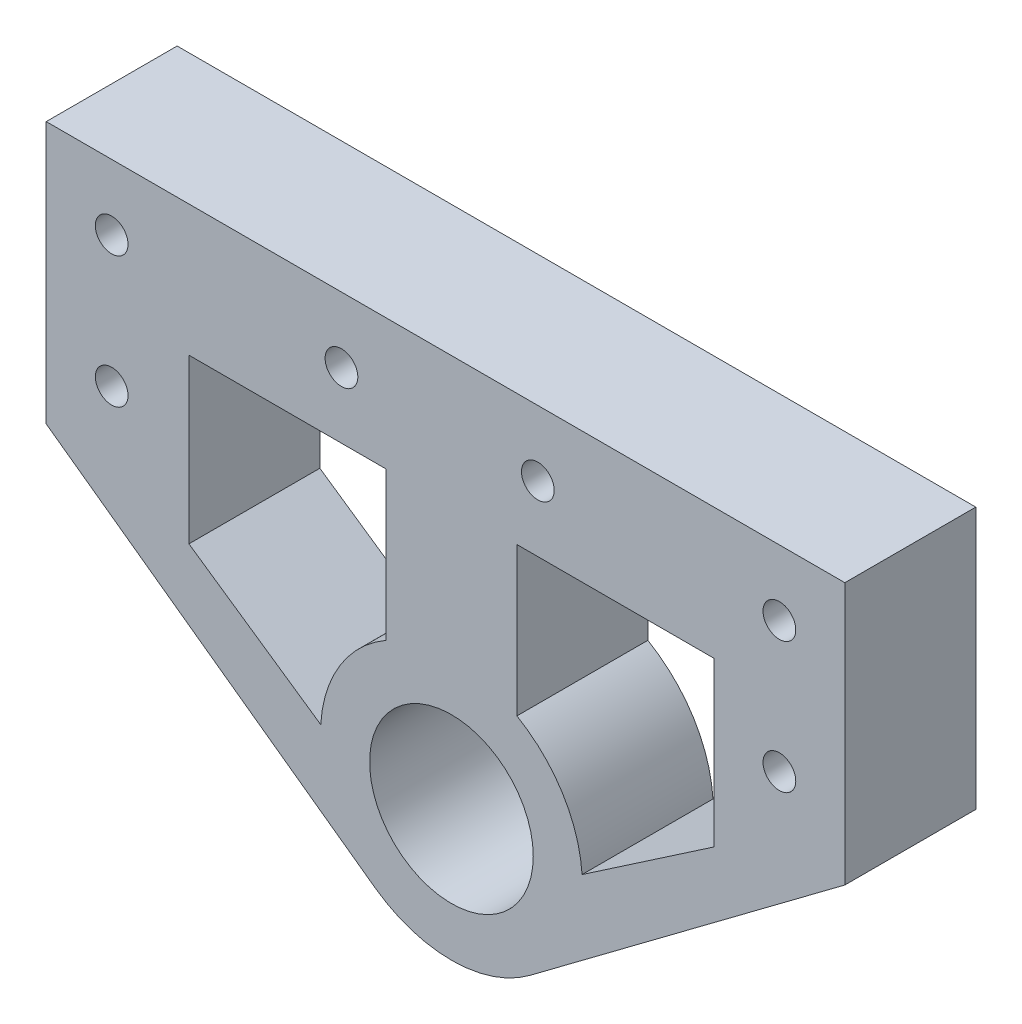
ISO-10303-21;
HEADER;
FILE_DESCRIPTION(('STEP AP214'),'2;1');
FILE_NAME('part.step','',(''),(''),'','','');
FILE_SCHEMA(('AUTOMOTIVE_DESIGN { 1 0 10303 214 1 1 1 1 }'));
ENDSEC;
DATA;
#1=APPLICATION_CONTEXT('core data for automotive mechanical design processes');
#2=APPLICATION_PROTOCOL_DEFINITION('international standard','automotive_design',2000,#1);
#3=PRODUCT_CONTEXT('',#1,'mechanical');
#4=PRODUCT('Part','Part','',(#3));
#5=PRODUCT_RELATED_PRODUCT_CATEGORY('part','',(#4));
#6=PRODUCT_DEFINITION_FORMATION('','',#4);
#7=PRODUCT_DEFINITION_CONTEXT('part definition',#1,'design');
#8=PRODUCT_DEFINITION('design','',#6,#7);
#9=PRODUCT_DEFINITION_SHAPE('','',#8);
#10=(LENGTH_UNIT() NAMED_UNIT(*) SI_UNIT(.MILLI.,.METRE.));
#11=(NAMED_UNIT(*) PLANE_ANGLE_UNIT() SI_UNIT($,.RADIAN.));
#12=(NAMED_UNIT(*) SI_UNIT($,.STERADIAN.) SOLID_ANGLE_UNIT());
#13=UNCERTAINTY_MEASURE_WITH_UNIT(LENGTH_MEASURE(1.E-05),#10,'distance_accuracy_value','');
#14=(GEOMETRIC_REPRESENTATION_CONTEXT(3) GLOBAL_UNCERTAINTY_ASSIGNED_CONTEXT((#13)) GLOBAL_UNIT_ASSIGNED_CONTEXT((#10,
#11,#12)) REPRESENTATION_CONTEXT('',''));
#15=CARTESIAN_POINT('',(0.,0.,0.));
#16=DIRECTION('',(0.,0.,1.));
#17=DIRECTION('',(1.,0.,0.));
#18=AXIS2_PLACEMENT_3D('',#15,#16,#17);
#19=CARTESIAN_POINT('',(0.,0.,12.7));
#20=DIRECTION('',(0.,0.,-1.));
#21=DIRECTION('',(-1.,0.,0.));
#22=AXIS2_PLACEMENT_3D('',#19,#20,#21);
#23=PLANE('',#22);
#24=DIRECTION('',(0.823987913618756,-0.566607375711091,0.));
#25=VECTOR('',#24,1.);
#26=CARTESIAN_POINT('',(-22.3811581632653,16.1254515802812,12.7));
#27=LINE('',#26,#25);
#28=CARTESIAN_POINT('',(-22.3811581632653,16.1254515802812,12.7));
#29=VERTEX_POINT('',#28);
#30=CARTESIAN_POINT('',(-9.59510921226123,7.33324780871722,12.7));
#31=VERTEX_POINT('',#30);
#32=EDGE_CURVE('E170',#29,#31,#27,.T.);
#33=ORIENTED_EDGE('',*,*,#32,.F.);
#34=DIRECTION('',(0.,-1.,0.));
#35=VECTOR('',#34,1.);
#36=CARTESIAN_POINT('',(-22.3811581632653,31.9767857142857,12.7));
#37=LINE('',#36,#35);
#38=CARTESIAN_POINT('',(-22.3811581632653,31.9767857142857,12.7));
#39=VERTEX_POINT('',#38);
#40=EDGE_CURVE('E176',#39,#29,#37,.T.);
#41=ORIENTED_EDGE('',*,*,#40,.F.);
#42=DIRECTION('',(-1.,0.,0.));
#43=VECTOR('',#42,1.);
#44=CARTESIAN_POINT('',(-22.3811581632653,31.9767857142857,12.7));
#45=LINE('',#44,#43);
#46=CARTESIAN_POINT('',(-3.26765816326529,31.9767857142857,12.7));
#47=VERTEX_POINT('',#46);
#48=EDGE_CURVE('E185',#47,#39,#45,.T.);
#49=ORIENTED_EDGE('',*,*,#48,.F.);
#50=DIRECTION('',(0.,1.,0.));
#51=VECTOR('',#50,1.);
#52=CARTESIAN_POINT('',(-3.26765816326529,31.9767857142857,12.7));
#53=LINE('',#52,#51);
#54=CARTESIAN_POINT('',(-3.26765816326529,17.5753083423481,12.7));
#55=VERTEX_POINT('',#54);
#56=EDGE_CURVE('E181',#55,#47,#53,.T.);
#57=ORIENTED_EDGE('',*,*,#56,.F.);
#58=CARTESIAN_POINT('',(3.08234183673471,6.5767857142857,12.7));
#59=DIRECTION('',(0.,0.,-1.));
#60=DIRECTION('',(-1.,0.,0.));
#61=AXIS2_PLACEMENT_3D('',#58,#59,#60);
#62=CIRCLE('',#61,12.7);
#63=EDGE_CURVE('E158',#31,#55,#62,.T.);
#64=ORIENTED_EDGE('',*,*,#63,.F.);
#65=EDGE_LOOP('',(#33,#41,#49,#57,#64));
#66=FACE_BOUND('',#65,.T.);
#67=DIRECTION('',(0.826436407611551,0.563030073951751,0.));
#68=VECTOR('',#67,1.);
#69=CARTESIAN_POINT('',(28.5458418367347,16.1254515802812,12.7));
#70=LINE('',#69,#68);
#71=CARTESIAN_POINT('',(15.7548939946992,7.41130461980597,12.7));
#72=VERTEX_POINT('',#71);
#73=CARTESIAN_POINT('',(28.5458418367347,16.1254515802812,12.7));
#74=VERTEX_POINT('',#73);
#75=EDGE_CURVE('E206',#72,#74,#70,.T.);
#76=ORIENTED_EDGE('',*,*,#75,.F.);
#77=CARTESIAN_POINT('',(3.08234183673471,6.5767857142857,12.7));
#78=DIRECTION('',(0.,0.,-1.));
#79=DIRECTION('',(1.,0.,0.));
#80=AXIS2_PLACEMENT_3D('',#77,#78,#79);
#81=CIRCLE('',#80,12.7);
#82=CARTESIAN_POINT('',(9.43234183673471,17.5753083423481,12.7));
#83=VERTEX_POINT('',#82);
#84=EDGE_CURVE('E203',#83,#72,#81,.T.);
#85=ORIENTED_EDGE('',*,*,#84,.F.);
#86=DIRECTION('',(0.,-1.,0.));
#87=VECTOR('',#86,1.);
#88=CARTESIAN_POINT('',(9.43234183673471,17.5753083423481,12.7));
#89=LINE('',#88,#87);
#90=CARTESIAN_POINT('',(9.43234183673471,31.9767857142857,12.7));
#91=VERTEX_POINT('',#90);
#92=EDGE_CURVE('E218',#91,#83,#89,.T.);
#93=ORIENTED_EDGE('',*,*,#92,.F.);
#94=DIRECTION('',(-1.,0.,0.));
#95=VECTOR('',#94,1.);
#96=CARTESIAN_POINT('',(9.43234183673471,31.9767857142857,12.7));
#97=LINE('',#96,#95);
#98=CARTESIAN_POINT('',(28.5458418367347,31.9767857142857,12.7));
#99=VERTEX_POINT('',#98);
#100=EDGE_CURVE('E214',#99,#91,#97,.T.);
#101=ORIENTED_EDGE('',*,*,#100,.F.);
#102=DIRECTION('',(0.,1.,0.));
#103=VECTOR('',#102,1.);
#104=CARTESIAN_POINT('',(28.5458418367347,31.9767857142857,12.7));
#105=LINE('',#104,#103);
#106=EDGE_CURVE('E210',#74,#99,#105,.T.);
#107=ORIENTED_EDGE('',*,*,#106,.F.);
#108=EDGE_LOOP('',(#76,#85,#93,#101,#107));
#109=FACE_BOUND('',#108,.T.);
#110=CARTESIAN_POINT('',(-7.5856581632653,38.3267857142857,12.7));
#111=DIRECTION('',(0.,0.,1.));
#112=DIRECTION('',(1.,0.,0.));
#113=AXIS2_PLACEMENT_3D('',#110,#111,#112);
#114=CIRCLE('',#113,1.5875);
#115=CARTESIAN_POINT('',(-5.9981581632653,38.3267857142857,12.7));
#116=VERTEX_POINT('',#115);
#117=EDGE_CURVE('E242',#116,#116,#114,.T.);
#118=ORIENTED_EDGE('',*,*,#117,.F.);
#119=EDGE_LOOP('',(#118));
#120=FACE_BOUND('',#119,.T.);
#121=CARTESIAN_POINT('',(34.8958418367347,25.6267857142857,12.7));
#122=DIRECTION('',(0.,0.,1.));
#123=DIRECTION('',(1.,0.,0.));
#124=AXIS2_PLACEMENT_3D('',#121,#122,#123);
#125=CIRCLE('',#124,1.5875);
#126=CARTESIAN_POINT('',(36.4833418367347,25.6267857142857,12.7));
#127=VERTEX_POINT('',#126);
#128=EDGE_CURVE('E251',#127,#127,#125,.T.);
#129=ORIENTED_EDGE('',*,*,#128,.F.);
#130=EDGE_LOOP('',(#129));
#131=FACE_BOUND('',#130,.T.);
#132=CARTESIAN_POINT('',(34.8958418367347,38.3267857142857,12.7));
#133=DIRECTION('',(0.,0.,1.));
#134=DIRECTION('',(1.,0.,0.));
#135=AXIS2_PLACEMENT_3D('',#132,#133,#134);
#136=CIRCLE('',#135,1.5875);
#137=CARTESIAN_POINT('',(36.4833418367347,38.3267857142857,12.7));
#138=VERTEX_POINT('',#137);
#139=EDGE_CURVE('E250',#138,#138,#136,.T.);
#140=ORIENTED_EDGE('',*,*,#139,.F.);
#141=EDGE_LOOP('',(#140));
#142=FACE_BOUND('',#141,.T.);
#143=CARTESIAN_POINT('',(-29.8741581632653,25.6267857142857,12.7));
#144=DIRECTION('',(0.,0.,1.));
#145=DIRECTION('',(1.,0.,0.));
#146=AXIS2_PLACEMENT_3D('',#143,#144,#145);
#147=CIRCLE('',#146,1.5875);
#148=CARTESIAN_POINT('',(-28.2866581632653,25.6267857142857,12.7));
#149=VERTEX_POINT('',#148);
#150=EDGE_CURVE('E267',#149,#149,#147,.T.);
#151=ORIENTED_EDGE('',*,*,#150,.F.);
#152=EDGE_LOOP('',(#151));
#153=FACE_BOUND('',#152,.T.);
#154=CARTESIAN_POINT('',(11.4643418367347,38.3267857142857,12.7));
#155=DIRECTION('',(0.,0.,1.));
#156=DIRECTION('',(1.,0.,0.));
#157=AXIS2_PLACEMENT_3D('',#154,#155,#156);
#158=CIRCLE('',#157,1.5875);
#159=CARTESIAN_POINT('',(13.0518418367347,38.3267857142857,12.7));
#160=VERTEX_POINT('',#159);
#161=EDGE_CURVE('E195',#160,#160,#158,.T.);
#162=ORIENTED_EDGE('',*,*,#161,.F.);
#163=EDGE_LOOP('',(#162));
#164=FACE_BOUND('',#163,.T.);
#165=CARTESIAN_POINT('',(-29.8741581632653,38.3267857142857,12.7));
#166=DIRECTION('',(0.,0.,1.));
#167=DIRECTION('',(1.,0.,0.));
#168=AXIS2_PLACEMENT_3D('',#165,#166,#167);
#169=CIRCLE('',#168,1.5875);
#170=CARTESIAN_POINT('',(-28.2866581632653,38.3267857142857,12.7));
#171=VERTEX_POINT('',#170);
#172=EDGE_CURVE('E266',#171,#171,#169,.T.);
#173=ORIENTED_EDGE('',*,*,#172,.F.);
#174=EDGE_LOOP('',(#173));
#175=FACE_BOUND('',#174,.T.);
#176=DIRECTION('',(0.810946660963558,-0.585120084317789,0.));
#177=VECTOR('',#176,1.);
#178=CARTESIAN_POINT('',(-36.2241581632653,19.2767857142857,12.7));
#179=LINE('',#178,#177);
#180=CARTESIAN_POINT('',(-36.2241581632653,19.2767857142857,12.7));
#181=VERTEX_POINT('',#180);
#182=CARTESIAN_POINT('',(-4.34868323410121,-3.72223687995149,12.7));
#183=VERTEX_POINT('',#182);
#184=EDGE_CURVE('E307',#181,#183,#179,.T.);
#185=ORIENTED_EDGE('',*,*,#184,.T.);
#186=CARTESIAN_POINT('',(3.08234183673471,6.57678571428571,12.7));
#187=DIRECTION('',(0.,0.,-1.));
#188=DIRECTION('',(-1.,0.,0.));
#189=AXIS2_PLACEMENT_3D('',#186,#187,#188);
#190=CIRCLE('',#189,12.7);
#191=CARTESIAN_POINT('',(10.6921932578428,-3.59081780614421,12.7));
#192=VERTEX_POINT('',#191);
#193=EDGE_CURVE('E11',#183,#192,#190,.F.);
#194=ORIENTED_EDGE('',*,*,#193,.T.);
#195=DIRECTION('',(0.800598702396056,0.599200899299852,0.));
#196=VECTOR('',#195,1.);
#197=CARTESIAN_POINT('',(3.22004479951696,-9.18328012531986,12.7));
#198=LINE('',#197,#196);
#199=CARTESIAN_POINT('',(41.2458418367347,19.2767857142857,12.7));
#200=VERTEX_POINT('',#199);
#201=EDGE_CURVE('E294',#192,#200,#198,.T.);
#202=ORIENTED_EDGE('',*,*,#201,.T.);
#203=DIRECTION('',(0.,1.,0.));
#204=VECTOR('',#203,1.);
#205=CARTESIAN_POINT('',(41.2458418367347,19.2767857142857,12.7));
#206=LINE('',#205,#204);
#207=CARTESIAN_POINT('',(41.2458418367347,44.6767857142857,12.7));
#208=VERTEX_POINT('',#207);
#209=EDGE_CURVE('E297',#200,#208,#206,.T.);
#210=ORIENTED_EDGE('',*,*,#209,.T.);
#211=DIRECTION('',(-1.,0.,0.));
#212=VECTOR('',#211,1.);
#213=CARTESIAN_POINT('',(41.2458418367347,44.6767857142857,12.7));
#214=LINE('',#213,#212);
#215=CARTESIAN_POINT('',(-36.2241581632653,44.6767857142857,12.7));
#216=VERTEX_POINT('',#215);
#217=EDGE_CURVE('E301',#208,#216,#214,.T.);
#218=ORIENTED_EDGE('',*,*,#217,.T.);
#219=DIRECTION('',(0.,-1.,0.));
#220=VECTOR('',#219,1.);
#221=CARTESIAN_POINT('',(-36.2241581632653,44.6767857142857,12.7));
#222=LINE('',#221,#220);
#223=EDGE_CURVE('E304',#216,#181,#222,.T.);
#224=ORIENTED_EDGE('',*,*,#223,.T.);
#225=EDGE_LOOP('',(#185,#194,#202,#210,#218,#224));
#226=FACE_BOUND('',#225,.T.);
#227=CARTESIAN_POINT('',(3.08234183673471,6.5767857142857,12.7));
#228=DIRECTION('',(0.,0.,1.));
#229=DIRECTION('',(1.,0.,0.));
#230=AXIS2_PLACEMENT_3D('',#227,#228,#229);
#231=CIRCLE('',#230,7.9375);
#232=CARTESIAN_POINT('',(11.0198418367347,6.5767857142857,12.7));
#233=VERTEX_POINT('',#232);
#234=EDGE_CURVE('E286',#233,#233,#231,.T.);
#235=ORIENTED_EDGE('',*,*,#234,.F.);
#236=EDGE_LOOP('',(#235));
#237=FACE_BOUND('',#236,.T.);
#238=ADVANCED_FACE('F39',(#66,#109,#120,#131,#142,#153,#164,#175,#226,#237),#23,.F.);
#239=CARTESIAN_POINT('',(0.,0.,0.));
#240=DIRECTION('',(0.,0.,-1.));
#241=DIRECTION('',(-1.,0.,0.));
#242=AXIS2_PLACEMENT_3D('',#239,#240,#241);
#243=PLANE('',#242);
#244=DIRECTION('',(0.,1.,0.));
#245=VECTOR('',#244,1.);
#246=CARTESIAN_POINT('',(-22.3811581632653,0.,0.));
#247=LINE('',#246,#245);
#248=CARTESIAN_POINT('',(-22.3811581632653,16.1254515802812,0.));
#249=VERTEX_POINT('',#248);
#250=CARTESIAN_POINT('',(-22.3811581632653,31.9767857142857,0.));
#251=VERTEX_POINT('',#250);
#252=EDGE_CURVE('E366',#249,#251,#247,.T.);
#253=ORIENTED_EDGE('',*,*,#252,.F.);
#254=DIRECTION('',(-0.823987913618756,0.566607375711091,0.));
#255=VECTOR('',#254,1.);
#256=CARTESIAN_POINT('',(0.343277895234075,0.499211356594817,0.));
#257=LINE('',#256,#255);
#258=CARTESIAN_POINT('',(-9.59510921226123,7.33324780871722,0.));
#259=VERTEX_POINT('',#258);
#260=EDGE_CURVE('E355',#259,#249,#257,.T.);
#261=ORIENTED_EDGE('',*,*,#260,.F.);
#262=CARTESIAN_POINT('',(3.08234183673471,6.5767857142857,0.));
#263=DIRECTION('',(0.,0.,-1.));
#264=DIRECTION('',(-1.,0.,0.));
#265=AXIS2_PLACEMENT_3D('',#262,#263,#264);
#266=CIRCLE('',#265,12.7);
#267=CARTESIAN_POINT('',(-3.26765816326529,17.5753083423481,0.));
#268=VERTEX_POINT('',#267);
#269=EDGE_CURVE('E161',#268,#259,#266,.F.);
#270=ORIENTED_EDGE('',*,*,#269,.F.);
#271=DIRECTION('',(0.,-1.,0.));
#272=VECTOR('',#271,1.);
#273=CARTESIAN_POINT('',(-3.26765816326529,0.,0.));
#274=LINE('',#273,#272);
#275=CARTESIAN_POINT('',(-3.26765816326529,31.9767857142857,0.));
#276=VERTEX_POINT('',#275);
#277=EDGE_CURVE('E360',#276,#268,#274,.T.);
#278=ORIENTED_EDGE('',*,*,#277,.F.);
#279=DIRECTION('',(1.,0.,0.));
#280=VECTOR('',#279,1.);
#281=CARTESIAN_POINT('',(0.,31.9767857142857,0.));
#282=LINE('',#281,#280);
#283=EDGE_CURVE('E363',#251,#276,#282,.T.);
#284=ORIENTED_EDGE('',*,*,#283,.F.);
#285=EDGE_LOOP('',(#253,#261,#270,#278,#284));
#286=FACE_BOUND('',#285,.T.);
#287=CARTESIAN_POINT('',(3.08234183673471,6.5767857142857,0.));
#288=DIRECTION('',(0.,0.,-1.));
#289=DIRECTION('',(-1.,0.,0.));
#290=AXIS2_PLACEMENT_3D('',#287,#288,#289);
#291=CIRCLE('',#290,12.7);
#292=CARTESIAN_POINT('',(15.7548939946992,7.41130461980597,0.));
#293=VERTEX_POINT('',#292);
#294=CARTESIAN_POINT('',(9.43234183673471,17.5753083423481,0.));
#295=VERTEX_POINT('',#294);
#296=EDGE_CURVE('E352',#293,#295,#291,.F.);
#297=ORIENTED_EDGE('',*,*,#296,.F.);
#298=DIRECTION('',(-0.826436407611551,-0.563030073951751,0.));
#299=VECTOR('',#298,1.);
#300=CARTESIAN_POINT('',(1.54580310227458,-2.26898707870456,0.));
#301=LINE('',#300,#299);
#302=CARTESIAN_POINT('',(28.5458418367347,16.1254515802812,0.));
#303=VERTEX_POINT('',#302);
#304=EDGE_CURVE('E339',#303,#293,#301,.T.);
#305=ORIENTED_EDGE('',*,*,#304,.F.);
#306=DIRECTION('',(0.,-1.,0.));
#307=VECTOR('',#306,1.);
#308=CARTESIAN_POINT('',(28.5458418367347,0.,0.));
#309=LINE('',#308,#307);
#310=CARTESIAN_POINT('',(28.5458418367347,31.9767857142857,0.));
#311=VERTEX_POINT('',#310);
#312=EDGE_CURVE('E342',#311,#303,#309,.T.);
#313=ORIENTED_EDGE('',*,*,#312,.F.);
#314=DIRECTION('',(1.,0.,0.));
#315=VECTOR('',#314,1.);
#316=CARTESIAN_POINT('',(0.,31.9767857142857,0.));
#317=LINE('',#316,#315);
#318=CARTESIAN_POINT('',(9.43234183673471,31.9767857142857,0.));
#319=VERTEX_POINT('',#318);
#320=EDGE_CURVE('E346',#319,#311,#317,.T.);
#321=ORIENTED_EDGE('',*,*,#320,.F.);
#322=DIRECTION('',(0.,1.,0.));
#323=VECTOR('',#322,1.);
#324=CARTESIAN_POINT('',(9.43234183673471,0.,0.));
#325=LINE('',#324,#323);
#326=EDGE_CURVE('E349',#295,#319,#325,.T.);
#327=ORIENTED_EDGE('',*,*,#326,.F.);
#328=EDGE_LOOP('',(#297,#305,#313,#321,#327));
#329=FACE_BOUND('',#328,.T.);
#330=CARTESIAN_POINT('',(-7.5856581632653,38.3267857142857,0.));
#331=DIRECTION('',(0.,0.,1.));
#332=DIRECTION('',(1.,0.,0.));
#333=AXIS2_PLACEMENT_3D('',#330,#331,#332);
#334=CIRCLE('',#333,1.5875);
#335=CARTESIAN_POINT('',(-5.9981581632653,38.3267857142857,0.));
#336=VERTEX_POINT('',#335);
#337=EDGE_CURVE('E255',#336,#336,#334,.T.);
#338=ORIENTED_EDGE('',*,*,#337,.T.);
#339=EDGE_LOOP('',(#338));
#340=FACE_BOUND('',#339,.T.);
#341=CARTESIAN_POINT('',(34.8958418367347,25.6267857142857,0.));
#342=DIRECTION('',(0.,0.,1.));
#343=DIRECTION('',(1.,0.,0.));
#344=AXIS2_PLACEMENT_3D('',#341,#342,#343);
#345=CIRCLE('',#344,1.5875);
#346=CARTESIAN_POINT('',(36.4833418367347,25.6267857142857,0.));
#347=VERTEX_POINT('',#346);
#348=EDGE_CURVE('E246',#347,#347,#345,.T.);
#349=ORIENTED_EDGE('',*,*,#348,.T.);
#350=EDGE_LOOP('',(#349));
#351=FACE_BOUND('',#350,.T.);
#352=CARTESIAN_POINT('',(34.8958418367347,38.3267857142857,0.));
#353=DIRECTION('',(0.,0.,1.));
#354=DIRECTION('',(1.,0.,0.));
#355=AXIS2_PLACEMENT_3D('',#352,#353,#354);
#356=CIRCLE('',#355,1.5875);
#357=CARTESIAN_POINT('',(36.4833418367347,38.3267857142857,0.));
#358=VERTEX_POINT('',#357);
#359=EDGE_CURVE('E271',#358,#358,#356,.T.);
#360=ORIENTED_EDGE('',*,*,#359,.T.);
#361=EDGE_LOOP('',(#360));
#362=FACE_BOUND('',#361,.T.);
#363=CARTESIAN_POINT('',(-29.8741581632653,25.6267857142857,0.));
#364=DIRECTION('',(0.,0.,1.));
#365=DIRECTION('',(1.,0.,0.));
#366=AXIS2_PLACEMENT_3D('',#363,#364,#365);
#367=CIRCLE('',#366,1.5875);
#368=CARTESIAN_POINT('',(-28.2866581632653,25.6267857142857,0.));
#369=VERTEX_POINT('',#368);
#370=EDGE_CURVE('E262',#369,#369,#367,.T.);
#371=ORIENTED_EDGE('',*,*,#370,.T.);
#372=EDGE_LOOP('',(#371));
#373=FACE_BOUND('',#372,.T.);
#374=CARTESIAN_POINT('',(11.4643418367347,38.3267857142857,0.));
#375=DIRECTION('',(0.,0.,1.));
#376=DIRECTION('',(1.,0.,0.));
#377=AXIS2_PLACEMENT_3D('',#374,#375,#376);
#378=CIRCLE('',#377,1.5875);
#379=CARTESIAN_POINT('',(13.0518418367347,38.3267857142857,0.));
#380=VERTEX_POINT('',#379);
#381=EDGE_CURVE('E238',#380,#380,#378,.T.);
#382=ORIENTED_EDGE('',*,*,#381,.T.);
#383=EDGE_LOOP('',(#382));
#384=FACE_BOUND('',#383,.T.);
#385=CARTESIAN_POINT('',(-29.8741581632653,38.3267857142857,0.));
#386=DIRECTION('',(0.,0.,1.));
#387=DIRECTION('',(1.,0.,0.));
#388=AXIS2_PLACEMENT_3D('',#385,#386,#387);
#389=CIRCLE('',#388,1.5875);
#390=CARTESIAN_POINT('',(-28.2866581632653,38.3267857142857,0.));
#391=VERTEX_POINT('',#390);
#392=EDGE_CURVE('E278',#391,#391,#389,.T.);
#393=ORIENTED_EDGE('',*,*,#392,.T.);
#394=EDGE_LOOP('',(#393));
#395=FACE_BOUND('',#394,.T.);
#396=DIRECTION('',(0.800598702396056,0.599200899299852,0.));
#397=VECTOR('',#396,1.);
#398=CARTESIAN_POINT('',(3.22004479951696,-9.18328012531986,0.));
#399=LINE('',#398,#397);
#400=CARTESIAN_POINT('',(10.6921932578428,-3.59081780614421,0.));
#401=VERTEX_POINT('',#400);
#402=CARTESIAN_POINT('',(41.2458418367347,19.2767857142857,0.));
#403=VERTEX_POINT('',#402);
#404=EDGE_CURVE('E290',#401,#403,#399,.T.);
#405=ORIENTED_EDGE('',*,*,#404,.F.);
#406=CARTESIAN_POINT('',(3.08234183673471,6.57678571428571,0.));
#407=DIRECTION('',(0.,0.,-1.));
#408=DIRECTION('',(-1.,0.,0.));
#409=AXIS2_PLACEMENT_3D('',#406,#407,#408);
#410=CIRCLE('',#409,12.7);
#411=CARTESIAN_POINT('',(-4.34868323410121,-3.72223687995149,0.));
#412=VERTEX_POINT('',#411);
#413=EDGE_CURVE('E62',#401,#412,#410,.T.);
#414=ORIENTED_EDGE('',*,*,#413,.T.);
#415=DIRECTION('',(0.810946660963558,-0.585120084317789,0.));
#416=VECTOR('',#415,1.);
#417=CARTESIAN_POINT('',(-36.2241581632653,19.2767857142857,0.));
#418=LINE('',#417,#416);
#419=CARTESIAN_POINT('',(-36.2241581632653,19.2767857142857,0.));
#420=VERTEX_POINT('',#419);
#421=EDGE_CURVE('E298',#420,#412,#418,.T.);
#422=ORIENTED_EDGE('',*,*,#421,.F.);
#423=DIRECTION('',(0.,-1.,0.));
#424=VECTOR('',#423,1.);
#425=CARTESIAN_POINT('',(-36.2241581632653,44.6767857142857,0.));
#426=LINE('',#425,#424);
#427=CARTESIAN_POINT('',(-36.2241581632653,44.6767857142857,0.));
#428=VERTEX_POINT('',#427);
#429=EDGE_CURVE('E319',#428,#420,#426,.T.);
#430=ORIENTED_EDGE('',*,*,#429,.F.);
#431=DIRECTION('',(-1.,0.,0.));
#432=VECTOR('',#431,1.);
#433=CARTESIAN_POINT('',(41.2458418367347,44.6767857142857,0.));
#434=LINE('',#433,#432);
#435=CARTESIAN_POINT('',(41.2458418367347,44.6767857142857,0.));
#436=VERTEX_POINT('',#435);
#437=EDGE_CURVE('E316',#436,#428,#434,.T.);
#438=ORIENTED_EDGE('',*,*,#437,.F.);
#439=DIRECTION('',(0.,1.,0.));
#440=VECTOR('',#439,1.);
#441=CARTESIAN_POINT('',(41.2458418367347,19.2767857142857,0.));
#442=LINE('',#441,#440);
#443=EDGE_CURVE('E313',#403,#436,#442,.T.);
#444=ORIENTED_EDGE('',*,*,#443,.F.);
#445=EDGE_LOOP('',(#405,#414,#422,#430,#438,#444));
#446=FACE_BOUND('',#445,.T.);
#447=CARTESIAN_POINT('',(3.08234183673471,6.5767857142857,0.));
#448=DIRECTION('',(0.,0.,1.));
#449=DIRECTION('',(1.,0.,0.));
#450=AXIS2_PLACEMENT_3D('',#447,#448,#449);
#451=CIRCLE('',#450,7.9375);
#452=CARTESIAN_POINT('',(11.0198418367347,6.5767857142857,0.));
#453=VERTEX_POINT('',#452);
#454=EDGE_CURVE('E282',#453,#453,#451,.T.);
#455=ORIENTED_EDGE('',*,*,#454,.T.);
#456=EDGE_LOOP('',(#455));
#457=FACE_BOUND('',#456,.T.);
#458=ADVANCED_FACE('F383',(#286,#329,#340,#351,#362,#373,#384,#395,#446,#457),#243,.T.);
#459=CARTESIAN_POINT('',(3.22004479951696,-9.18328012531986,12.7));
#460=DIRECTION('',(-0.599200899299852,0.800598702396056,0.));
#461=DIRECTION('',(-0.800598702396056,-0.599200899299852,0.));
#462=AXIS2_PLACEMENT_3D('',#459,#460,#461);
#463=PLANE('',#462);
#464=ORIENTED_EDGE('',*,*,#201,.F.);
#465=DIRECTION('',(0.,0.,-1.));
#466=VECTOR('',#465,1.);
#467=CARTESIAN_POINT('',(10.6921932578428,-3.59081780614421,12.7));
#468=LINE('',#467,#466);
#469=EDGE_CURVE('E369',#192,#401,#468,.T.);
#470=ORIENTED_EDGE('',*,*,#469,.T.);
#471=ORIENTED_EDGE('',*,*,#404,.T.);
#472=DIRECTION('',(0.,0.,-1.));
#473=VECTOR('',#472,1.);
#474=CARTESIAN_POINT('',(41.2458418367347,19.2767857142857,12.7));
#475=LINE('',#474,#473);
#476=EDGE_CURVE('E335',#200,#403,#475,.T.);
#477=ORIENTED_EDGE('',*,*,#476,.F.);
#478=EDGE_LOOP('',(#464,#470,#471,#477));
#479=FACE_BOUND('',#478,.T.);
#480=ADVANCED_FACE('F378',(#479),#463,.F.);
#481=CARTESIAN_POINT('',(41.2458418367347,19.2767857142857,12.7));
#482=DIRECTION('',(-1.,0.,0.));
#483=DIRECTION('',(0.,0.,1.));
#484=AXIS2_PLACEMENT_3D('',#481,#482,#483);
#485=PLANE('',#484);
#486=ORIENTED_EDGE('',*,*,#443,.T.);
#487=DIRECTION('',(0.,0.,-1.));
#488=VECTOR('',#487,1.);
#489=CARTESIAN_POINT('',(41.2458418367347,44.6767857142857,12.7));
#490=LINE('',#489,#488);
#491=EDGE_CURVE('E331',#208,#436,#490,.T.);
#492=ORIENTED_EDGE('',*,*,#491,.F.);
#493=ORIENTED_EDGE('',*,*,#209,.F.);
#494=ORIENTED_EDGE('',*,*,#476,.T.);
#495=EDGE_LOOP('',(#486,#492,#493,#494));
#496=FACE_BOUND('',#495,.T.);
#497=ADVANCED_FACE('F390',(#496),#485,.F.);
#498=CARTESIAN_POINT('',(41.2458418367347,44.6767857142857,12.7));
#499=DIRECTION('',(0.,-1.,0.));
#500=DIRECTION('',(0.,0.,-1.));
#501=AXIS2_PLACEMENT_3D('',#498,#499,#500);
#502=PLANE('',#501);
#503=ORIENTED_EDGE('',*,*,#437,.T.);
#504=DIRECTION('',(0.,0.,-1.));
#505=VECTOR('',#504,1.);
#506=CARTESIAN_POINT('',(-36.2241581632653,44.6767857142857,12.7));
#507=LINE('',#506,#505);
#508=EDGE_CURVE('E327',#216,#428,#507,.T.);
#509=ORIENTED_EDGE('',*,*,#508,.F.);
#510=ORIENTED_EDGE('',*,*,#217,.F.);
#511=ORIENTED_EDGE('',*,*,#491,.T.);
#512=EDGE_LOOP('',(#503,#509,#510,#511));
#513=FACE_BOUND('',#512,.T.);
#514=ADVANCED_FACE('F417',(#513),#502,.F.);
#515=CARTESIAN_POINT('',(-36.2241581632653,44.6767857142857,12.7));
#516=DIRECTION('',(1.,0.,0.));
#517=DIRECTION('',(0.,0.,-1.));
#518=AXIS2_PLACEMENT_3D('',#515,#516,#517);
#519=PLANE('',#518);
#520=ORIENTED_EDGE('',*,*,#429,.T.);
#521=DIRECTION('',(0.,0.,-1.));
#522=VECTOR('',#521,1.);
#523=CARTESIAN_POINT('',(-36.2241581632653,19.2767857142857,12.7));
#524=LINE('',#523,#522);
#525=EDGE_CURVE('E310',#181,#420,#524,.T.);
#526=ORIENTED_EDGE('',*,*,#525,.F.);
#527=ORIENTED_EDGE('',*,*,#223,.F.);
#528=ORIENTED_EDGE('',*,*,#508,.T.);
#529=EDGE_LOOP('',(#520,#526,#527,#528));
#530=FACE_BOUND('',#529,.T.);
#531=ADVANCED_FACE('F414',(#530),#519,.F.);
#532=CARTESIAN_POINT('',(-36.2241581632653,19.2767857142857,12.7));
#533=DIRECTION('',(0.585120084317789,0.810946660963558,0.));
#534=DIRECTION('',(-0.810946660963558,0.585120084317789,0.));
#535=AXIS2_PLACEMENT_3D('',#532,#533,#534);
#536=PLANE('',#535);
#537=ORIENTED_EDGE('',*,*,#421,.T.);
#538=DIRECTION('',(0.,0.,-1.));
#539=VECTOR('',#538,1.);
#540=CARTESIAN_POINT('',(-4.34868323410121,-3.72223687995148,12.7));
#541=LINE('',#540,#539);
#542=EDGE_CURVE('E48',#412,#183,#541,.F.);
#543=ORIENTED_EDGE('',*,*,#542,.T.);
#544=ORIENTED_EDGE('',*,*,#184,.F.);
#545=ORIENTED_EDGE('',*,*,#525,.T.);
#546=EDGE_LOOP('',(#537,#543,#544,#545));
#547=FACE_BOUND('',#546,.T.);
#548=ADVANCED_FACE('F411',(#547),#536,.F.);
#549=CARTESIAN_POINT('',(3.08234183673471,6.5767857142857,12.7));
#550=DIRECTION('',(0.,0.,-1.));
#551=DIRECTION('',(-1.,0.,0.));
#552=AXIS2_PLACEMENT_3D('',#549,#550,#551);
#553=CYLINDRICAL_SURFACE('',#552,7.9375);
#554=ORIENTED_EDGE('',*,*,#234,.T.);
#555=EDGE_LOOP('',(#554));
#556=FACE_BOUND('',#555,.T.);
#557=ORIENTED_EDGE('',*,*,#454,.F.);
#558=EDGE_LOOP('',(#557));
#559=FACE_BOUND('',#558,.T.);
#560=ADVANCED_FACE('F408',(#556,#559),#553,.F.);
#561=CARTESIAN_POINT('',(-29.8741581632653,38.3267857142857,0.));
#562=DIRECTION('',(0.,0.,1.));
#563=DIRECTION('',(1.,0.,0.));
#564=AXIS2_PLACEMENT_3D('',#561,#562,#563);
#565=CYLINDRICAL_SURFACE('',#564,1.5875);
#566=ORIENTED_EDGE('',*,*,#392,.F.);
#567=EDGE_LOOP('',(#566));
#568=FACE_BOUND('',#567,.T.);
#569=ORIENTED_EDGE('',*,*,#172,.T.);
#570=EDGE_LOOP('',(#569));
#571=FACE_BOUND('',#570,.T.);
#572=ADVANCED_FACE('F450',(#568,#571),#565,.F.);
#573=CARTESIAN_POINT('',(11.4643418367347,38.3267857142857,0.));
#574=DIRECTION('',(0.,0.,1.));
#575=DIRECTION('',(1.,0.,0.));
#576=AXIS2_PLACEMENT_3D('',#573,#574,#575);
#577=CYLINDRICAL_SURFACE('',#576,1.5875);
#578=ORIENTED_EDGE('',*,*,#381,.F.);
#579=EDGE_LOOP('',(#578));
#580=FACE_BOUND('',#579,.T.);
#581=ORIENTED_EDGE('',*,*,#161,.T.);
#582=EDGE_LOOP('',(#581));
#583=FACE_BOUND('',#582,.T.);
#584=ADVANCED_FACE('F457',(#580,#583),#577,.F.);
#585=CARTESIAN_POINT('',(-29.8741581632653,25.6267857142857,0.));
#586=DIRECTION('',(0.,0.,1.));
#587=DIRECTION('',(1.,0.,0.));
#588=AXIS2_PLACEMENT_3D('',#585,#586,#587);
#589=CYLINDRICAL_SURFACE('',#588,1.5875);
#590=ORIENTED_EDGE('',*,*,#370,.F.);
#591=EDGE_LOOP('',(#590));
#592=FACE_BOUND('',#591,.T.);
#593=ORIENTED_EDGE('',*,*,#150,.T.);
#594=EDGE_LOOP('',(#593));
#595=FACE_BOUND('',#594,.T.);
#596=ADVANCED_FACE('F464',(#592,#595),#589,.F.);
#597=CARTESIAN_POINT('',(34.8958418367347,38.3267857142857,0.));
#598=DIRECTION('',(0.,0.,1.));
#599=DIRECTION('',(1.,0.,0.));
#600=AXIS2_PLACEMENT_3D('',#597,#598,#599);
#601=CYLINDRICAL_SURFACE('',#600,1.5875);
#602=ORIENTED_EDGE('',*,*,#359,.F.);
#603=EDGE_LOOP('',(#602));
#604=FACE_BOUND('',#603,.T.);
#605=ORIENTED_EDGE('',*,*,#139,.T.);
#606=EDGE_LOOP('',(#605));
#607=FACE_BOUND('',#606,.T.);
#608=ADVANCED_FACE('F472',(#604,#607),#601,.F.);
#609=CARTESIAN_POINT('',(34.8958418367347,25.6267857142857,0.));
#610=DIRECTION('',(0.,0.,1.));
#611=DIRECTION('',(1.,0.,0.));
#612=AXIS2_PLACEMENT_3D('',#609,#610,#611);
#613=CYLINDRICAL_SURFACE('',#612,1.5875);
#614=ORIENTED_EDGE('',*,*,#348,.F.);
#615=EDGE_LOOP('',(#614));
#616=FACE_BOUND('',#615,.T.);
#617=ORIENTED_EDGE('',*,*,#128,.T.);
#618=EDGE_LOOP('',(#617));
#619=FACE_BOUND('',#618,.T.);
#620=ADVANCED_FACE('F480',(#616,#619),#613,.F.);
#621=CARTESIAN_POINT('',(-7.5856581632653,38.3267857142857,0.));
#622=DIRECTION('',(0.,0.,1.));
#623=DIRECTION('',(1.,0.,0.));
#624=AXIS2_PLACEMENT_3D('',#621,#622,#623);
#625=CYLINDRICAL_SURFACE('',#624,1.5875);
#626=ORIENTED_EDGE('',*,*,#337,.F.);
#627=EDGE_LOOP('',(#626));
#628=FACE_BOUND('',#627,.T.);
#629=ORIENTED_EDGE('',*,*,#117,.T.);
#630=EDGE_LOOP('',(#629));
#631=FACE_BOUND('',#630,.T.);
#632=ADVANCED_FACE('F488',(#628,#631),#625,.F.);
#633=CARTESIAN_POINT('',(3.08234183673471,6.5767857142857,-2.54));
#634=DIRECTION('',(0.,0.,1.));
#635=DIRECTION('',(1.,0.,0.));
#636=AXIS2_PLACEMENT_3D('',#633,#634,#635);
#637=CYLINDRICAL_SURFACE('',#636,12.7);
#638=ORIENTED_EDGE('',*,*,#296,.T.);
#639=DIRECTION('',(0.,0.,1.));
#640=VECTOR('',#639,1.);
#641=CARTESIAN_POINT('',(9.43234183673471,17.5753083423481,-2.54));
#642=LINE('',#641,#640);
#643=EDGE_CURVE('E223',#295,#83,#642,.T.);
#644=ORIENTED_EDGE('',*,*,#643,.T.);
#645=ORIENTED_EDGE('',*,*,#84,.T.);
#646=DIRECTION('',(0.,0.,1.));
#647=VECTOR('',#646,1.);
#648=CARTESIAN_POINT('',(15.7548939946992,7.41130461980597,-2.54));
#649=LINE('',#648,#647);
#650=EDGE_CURVE('E222',#293,#72,#649,.T.);
#651=ORIENTED_EDGE('',*,*,#650,.F.);
#652=EDGE_LOOP('',(#638,#644,#645,#651));
#653=FACE_BOUND('',#652,.T.);
#654=ADVANCED_FACE('F496',(#653),#637,.T.);
#655=CARTESIAN_POINT('',(9.43234183673471,17.5753083423481,-2.54));
#656=DIRECTION('',(-1.,0.,0.));
#657=DIRECTION('',(0.,-1.,0.));
#658=AXIS2_PLACEMENT_3D('',#655,#656,#657);
#659=PLANE('',#658);
#660=ORIENTED_EDGE('',*,*,#326,.T.);
#661=DIRECTION('',(0.,0.,1.));
#662=VECTOR('',#661,1.);
#663=CARTESIAN_POINT('',(9.43234183673471,31.9767857142857,-2.54));
#664=LINE('',#663,#662);
#665=EDGE_CURVE('E226',#319,#91,#664,.T.);
#666=ORIENTED_EDGE('',*,*,#665,.T.);
#667=ORIENTED_EDGE('',*,*,#92,.T.);
#668=ORIENTED_EDGE('',*,*,#643,.F.);
#669=EDGE_LOOP('',(#660,#666,#667,#668));
#670=FACE_BOUND('',#669,.T.);
#671=ADVANCED_FACE('F504',(#670),#659,.F.);
#672=CARTESIAN_POINT('',(9.43234183673471,31.9767857142857,-2.54));
#673=DIRECTION('',(0.,1.,0.));
#674=DIRECTION('',(0.,0.,1.));
#675=AXIS2_PLACEMENT_3D('',#672,#673,#674);
#676=PLANE('',#675);
#677=ORIENTED_EDGE('',*,*,#320,.T.);
#678=DIRECTION('',(0.,0.,1.));
#679=VECTOR('',#678,1.);
#680=CARTESIAN_POINT('',(28.5458418367347,31.9767857142857,-2.54));
#681=LINE('',#680,#679);
#682=EDGE_CURVE('E229',#311,#99,#681,.T.);
#683=ORIENTED_EDGE('',*,*,#682,.T.);
#684=ORIENTED_EDGE('',*,*,#100,.T.);
#685=ORIENTED_EDGE('',*,*,#665,.F.);
#686=EDGE_LOOP('',(#677,#683,#684,#685));
#687=FACE_BOUND('',#686,.T.);
#688=ADVANCED_FACE('F512',(#687),#676,.F.);
#689=CARTESIAN_POINT('',(28.5458418367347,31.9767857142857,-2.54));
#690=DIRECTION('',(1.,0.,0.));
#691=DIRECTION('',(0.,1.,0.));
#692=AXIS2_PLACEMENT_3D('',#689,#690,#691);
#693=PLANE('',#692);
#694=ORIENTED_EDGE('',*,*,#312,.T.);
#695=DIRECTION('',(0.,0.,1.));
#696=VECTOR('',#695,1.);
#697=CARTESIAN_POINT('',(28.5458418367347,16.1254515802812,-2.54));
#698=LINE('',#697,#696);
#699=EDGE_CURVE('E232',#303,#74,#698,.T.);
#700=ORIENTED_EDGE('',*,*,#699,.T.);
#701=ORIENTED_EDGE('',*,*,#106,.T.);
#702=ORIENTED_EDGE('',*,*,#682,.F.);
#703=EDGE_LOOP('',(#694,#700,#701,#702));
#704=FACE_BOUND('',#703,.T.);
#705=ADVANCED_FACE('F520',(#704),#693,.F.);
#706=CARTESIAN_POINT('',(28.5458418367347,16.1254515802812,-2.54));
#707=DIRECTION('',(0.563030073951751,-0.826436407611551,0.));
#708=DIRECTION('',(0.826436407611551,0.563030073951751,0.));
#709=AXIS2_PLACEMENT_3D('',#706,#707,#708);
#710=PLANE('',#709);
#711=ORIENTED_EDGE('',*,*,#304,.T.);
#712=ORIENTED_EDGE('',*,*,#650,.T.);
#713=ORIENTED_EDGE('',*,*,#75,.T.);
#714=ORIENTED_EDGE('',*,*,#699,.F.);
#715=EDGE_LOOP('',(#711,#712,#713,#714));
#716=FACE_BOUND('',#715,.T.);
#717=ADVANCED_FACE('F528',(#716),#710,.F.);
#718=CARTESIAN_POINT('',(-22.3811581632653,31.9767857142857,-2.54));
#719=DIRECTION('',(-1.,0.,0.));
#720=DIRECTION('',(0.,0.,1.));
#721=AXIS2_PLACEMENT_3D('',#718,#719,#720);
#722=PLANE('',#721);
#723=ORIENTED_EDGE('',*,*,#252,.T.);
#724=DIRECTION('',(0.,0.,1.));
#725=VECTOR('',#724,1.);
#726=CARTESIAN_POINT('',(-22.3811581632653,31.9767857142857,-2.54));
#727=LINE('',#726,#725);
#728=EDGE_CURVE('E192',#251,#39,#727,.T.);
#729=ORIENTED_EDGE('',*,*,#728,.T.);
#730=ORIENTED_EDGE('',*,*,#40,.T.);
#731=DIRECTION('',(0.,0.,1.));
#732=VECTOR('',#731,1.);
#733=CARTESIAN_POINT('',(-22.3811581632653,16.1254515802812,-2.54));
#734=LINE('',#733,#732);
#735=EDGE_CURVE('E166',#249,#29,#734,.T.);
#736=ORIENTED_EDGE('',*,*,#735,.F.);
#737=EDGE_LOOP('',(#723,#729,#730,#736));
#738=FACE_BOUND('',#737,.T.);
#739=ADVANCED_FACE('F536',(#738),#722,.F.);
#740=CARTESIAN_POINT('',(-22.3811581632653,31.9767857142857,-2.54));
#741=DIRECTION('',(0.,1.,0.));
#742=DIRECTION('',(0.,0.,1.));
#743=AXIS2_PLACEMENT_3D('',#740,#741,#742);
#744=PLANE('',#743);
#745=ORIENTED_EDGE('',*,*,#283,.T.);
#746=DIRECTION('',(0.,0.,1.));
#747=VECTOR('',#746,1.);
#748=CARTESIAN_POINT('',(-3.26765816326529,31.9767857142857,-2.54));
#749=LINE('',#748,#747);
#750=EDGE_CURVE('E196',#276,#47,#749,.T.);
#751=ORIENTED_EDGE('',*,*,#750,.T.);
#752=ORIENTED_EDGE('',*,*,#48,.T.);
#753=ORIENTED_EDGE('',*,*,#728,.F.);
#754=EDGE_LOOP('',(#745,#751,#752,#753));
#755=FACE_BOUND('',#754,.T.);
#756=ADVANCED_FACE('F544',(#755),#744,.F.);
#757=CARTESIAN_POINT('',(-3.26765816326529,31.9767857142857,-2.54));
#758=DIRECTION('',(1.,0.,0.));
#759=DIRECTION('',(0.,1.,0.));
#760=AXIS2_PLACEMENT_3D('',#757,#758,#759);
#761=PLANE('',#760);
#762=ORIENTED_EDGE('',*,*,#277,.T.);
#763=DIRECTION('',(0.,0.,1.));
#764=VECTOR('',#763,1.);
#765=CARTESIAN_POINT('',(-3.26765816326529,17.5753083423481,-2.54));
#766=LINE('',#765,#764);
#767=EDGE_CURVE('E165',#268,#55,#766,.T.);
#768=ORIENTED_EDGE('',*,*,#767,.T.);
#769=ORIENTED_EDGE('',*,*,#56,.T.);
#770=ORIENTED_EDGE('',*,*,#750,.F.);
#771=EDGE_LOOP('',(#762,#768,#769,#770));
#772=FACE_BOUND('',#771,.T.);
#773=ADVANCED_FACE('F552',(#772),#761,.F.);
#774=CARTESIAN_POINT('',(3.08234183673471,6.5767857142857,-2.54));
#775=DIRECTION('',(0.,0.,1.));
#776=DIRECTION('',(1.,0.,0.));
#777=AXIS2_PLACEMENT_3D('',#774,#775,#776);
#778=CYLINDRICAL_SURFACE('',#777,12.7);
#779=ORIENTED_EDGE('',*,*,#269,.T.);
#780=DIRECTION('',(0.,0.,1.));
#781=VECTOR('',#780,1.);
#782=CARTESIAN_POINT('',(-9.59510921226123,7.33324780871722,-2.54));
#783=LINE('',#782,#781);
#784=EDGE_CURVE('E153',#259,#31,#783,.T.);
#785=ORIENTED_EDGE('',*,*,#784,.T.);
#786=ORIENTED_EDGE('',*,*,#63,.T.);
#787=ORIENTED_EDGE('',*,*,#767,.F.);
#788=EDGE_LOOP('',(#779,#785,#786,#787));
#789=FACE_BOUND('',#788,.T.);
#790=ADVANCED_FACE('F155',(#789),#778,.T.);
#791=CARTESIAN_POINT('',(-22.3811581632653,16.1254515802812,-2.54));
#792=DIRECTION('',(-0.566607375711091,-0.823987913618756,0.));
#793=DIRECTION('',(0.823987913618756,-0.566607375711091,0.));
#794=AXIS2_PLACEMENT_3D('',#791,#792,#793);
#795=PLANE('',#794);
#796=ORIENTED_EDGE('',*,*,#260,.T.);
#797=ORIENTED_EDGE('',*,*,#735,.T.);
#798=ORIENTED_EDGE('',*,*,#32,.T.);
#799=ORIENTED_EDGE('',*,*,#784,.F.);
#800=EDGE_LOOP('',(#796,#797,#798,#799));
#801=FACE_BOUND('',#800,.T.);
#802=ADVANCED_FACE('F171',(#801),#795,.F.);
#803=CARTESIAN_POINT('',(3.08234183673471,6.57678571428571,12.7));
#804=DIRECTION('',(0.,0.,-1.));
#805=DIRECTION('',(-1.,0.,0.));
#806=AXIS2_PLACEMENT_3D('',#803,#804,#805);
#807=CYLINDRICAL_SURFACE('',#806,12.7);
#808=ORIENTED_EDGE('',*,*,#193,.F.);
#809=ORIENTED_EDGE('',*,*,#542,.F.);
#810=ORIENTED_EDGE('',*,*,#413,.F.);
#811=ORIENTED_EDGE('',*,*,#469,.F.);
#812=EDGE_LOOP('',(#808,#809,#810,#811));
#813=FACE_BOUND('',#812,.T.);
#814=ADVANCED_FACE('F41',(#813),#807,.T.);
#815=CLOSED_SHELL('',(#238,#458,#480,#497,#514,#531,#548,#560,#572,#584,#596,#608,#620,#632,
#654,#671,#688,#705,#717,#739,#756,#773,#790,#802,#814));
#816=MANIFOLD_SOLID_BREP('B2',#815);
#817=ADVANCED_BREP_SHAPE_REPRESENTATION('',(#18,#816),#14);
#818=SHAPE_DEFINITION_REPRESENTATION(#9,#817);
ENDSEC;
END-ISO-10303-21;
